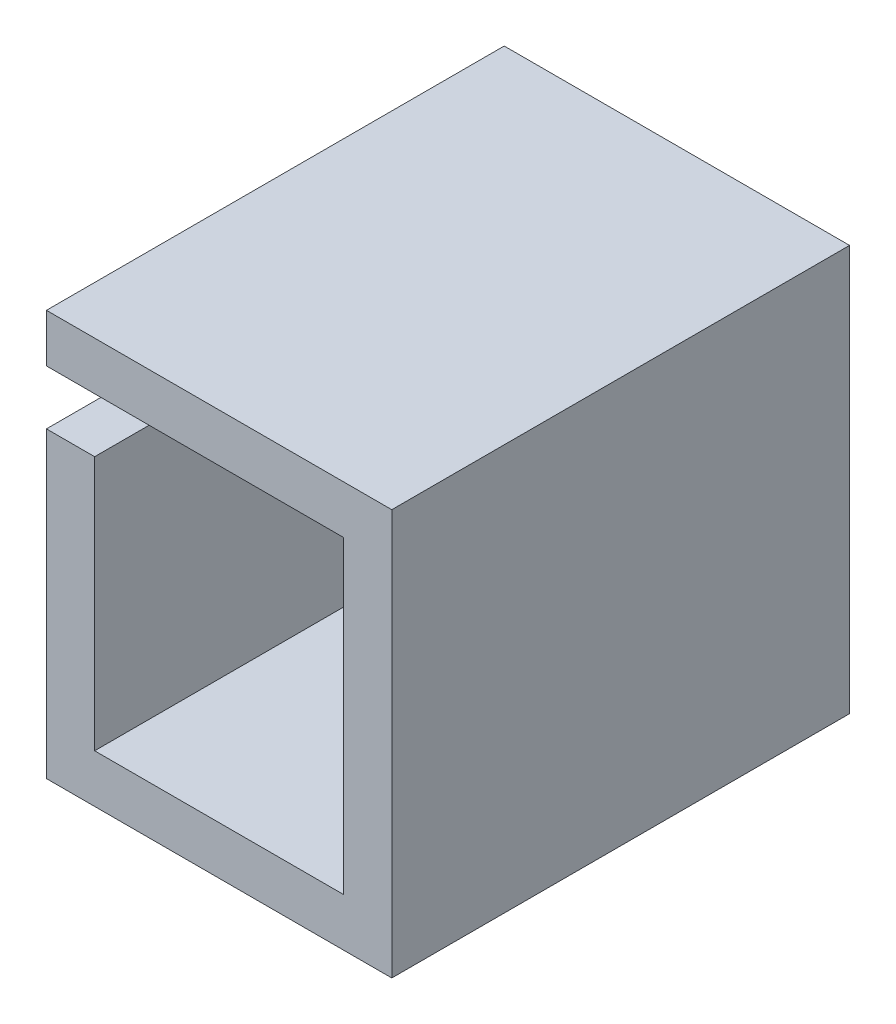
ISO-10303-21;
HEADER;
FILE_DESCRIPTION(('STEP AP214'),'2;1');
FILE_NAME('part.step','',(''),(''),'','','');
FILE_SCHEMA(('AUTOMOTIVE_DESIGN { 1 0 10303 214 1 1 1 1 }'));
ENDSEC;
DATA;
#1=APPLICATION_CONTEXT('core data for automotive mechanical design processes');
#2=APPLICATION_PROTOCOL_DEFINITION('international standard','automotive_design',2000,#1);
#3=PRODUCT_CONTEXT('',#1,'mechanical');
#4=PRODUCT('Part','Part','',(#3));
#5=PRODUCT_RELATED_PRODUCT_CATEGORY('part','',(#4));
#6=PRODUCT_DEFINITION_FORMATION('','',#4);
#7=PRODUCT_DEFINITION_CONTEXT('part definition',#1,'design');
#8=PRODUCT_DEFINITION('design','',#6,#7);
#9=PRODUCT_DEFINITION_SHAPE('','',#8);
#10=(LENGTH_UNIT() NAMED_UNIT(*) SI_UNIT(.MILLI.,.METRE.));
#11=(NAMED_UNIT(*) PLANE_ANGLE_UNIT() SI_UNIT($,.RADIAN.));
#12=(NAMED_UNIT(*) SI_UNIT($,.STERADIAN.) SOLID_ANGLE_UNIT());
#13=UNCERTAINTY_MEASURE_WITH_UNIT(LENGTH_MEASURE(1.E-05),#10,'distance_accuracy_value','');
#14=(GEOMETRIC_REPRESENTATION_CONTEXT(3) GLOBAL_UNCERTAINTY_ASSIGNED_CONTEXT((#13)) GLOBAL_UNIT_ASSIGNED_CONTEXT((#10,
#11,#12)) REPRESENTATION_CONTEXT('',''));
#15=CARTESIAN_POINT('',(0.,0.,0.));
#16=DIRECTION('',(0.,0.,1.));
#17=DIRECTION('',(1.,0.,0.));
#18=AXIS2_PLACEMENT_3D('',#15,#16,#17);
#19=CARTESIAN_POINT('',(3.64285714285715,7.,25.5));
#20=DIRECTION('',(0.,1.,0.));
#21=DIRECTION('',(-1.,0.,0.));
#22=AXIS2_PLACEMENT_3D('',#19,#20,#21);
#23=PLANE('',#22);
#24=DIRECTION('',(1.,0.,0.));
#25=VECTOR('',#24,1.);
#26=CARTESIAN_POINT('',(3.64285714285715,7.,0.));
#27=LINE('',#26,#25);
#28=CARTESIAN_POINT('',(-14.8571428571429,6.99999999999999,0.));
#29=VERTEX_POINT('',#28);
#30=CARTESIAN_POINT('',(3.64285714285715,7.,0.));
#31=VERTEX_POINT('',#30);
#32=EDGE_CURVE('E150',#29,#31,#27,.T.);
#33=ORIENTED_EDGE('',*,*,#32,.T.);
#34=DIRECTION('',(0.,0.,-1.));
#35=VECTOR('',#34,1.);
#36=CARTESIAN_POINT('',(3.64285714285715,7.,25.5));
#37=LINE('',#36,#35);
#38=CARTESIAN_POINT('',(3.64285714285715,7.,25.5));
#39=VERTEX_POINT('',#38);
#40=EDGE_CURVE('E48',#39,#31,#37,.T.);
#41=ORIENTED_EDGE('',*,*,#40,.F.);
#42=DIRECTION('',(1.,0.,0.));
#43=VECTOR('',#42,1.);
#44=CARTESIAN_POINT('',(3.64285714285715,7.,25.5));
#45=LINE('',#44,#43);
#46=CARTESIAN_POINT('',(-14.8571428571429,6.99999999999999,25.5));
#47=VERTEX_POINT('',#46);
#48=EDGE_CURVE('E155',#47,#39,#45,.T.);
#49=ORIENTED_EDGE('',*,*,#48,.F.);
#50=DIRECTION('',(0.,0.,-1.));
#51=VECTOR('',#50,1.);
#52=CARTESIAN_POINT('',(-14.8571428571429,6.99999999999999,25.5));
#53=LINE('',#52,#51);
#54=EDGE_CURVE('E11',#47,#29,#53,.T.);
#55=ORIENTED_EDGE('',*,*,#54,.T.);
#56=EDGE_LOOP('',(#33,#41,#49,#55));
#57=FACE_BOUND('',#56,.T.);
#58=ADVANCED_FACE('F39',(#57),#23,.F.);
#59=CARTESIAN_POINT('',(3.64285714285715,-12.25,25.5));
#60=DIRECTION('',(1.,0.,0.));
#61=DIRECTION('',(0.,0.,-1.));
#62=AXIS2_PLACEMENT_3D('',#59,#60,#61);
#63=PLANE('',#62);
#64=DIRECTION('',(0.,-1.,0.));
#65=VECTOR('',#64,1.);
#66=CARTESIAN_POINT('',(3.64285714285715,-12.25,0.));
#67=LINE('',#66,#65);
#68=CARTESIAN_POINT('',(3.64285714285715,-12.25,0.));
#69=VERTEX_POINT('',#68);
#70=EDGE_CURVE('E185',#31,#69,#67,.T.);
#71=ORIENTED_EDGE('',*,*,#70,.T.);
#72=DIRECTION('',(0.,0.,-1.));
#73=VECTOR('',#72,1.);
#74=CARTESIAN_POINT('',(3.64285714285715,-12.25,25.5));
#75=LINE('',#74,#73);
#76=CARTESIAN_POINT('',(3.64285714285715,-12.25,25.5));
#77=VERTEX_POINT('',#76);
#78=EDGE_CURVE('E218',#77,#69,#75,.T.);
#79=ORIENTED_EDGE('',*,*,#78,.F.);
#80=DIRECTION('',(0.,-1.,0.));
#81=VECTOR('',#80,1.);
#82=CARTESIAN_POINT('',(3.64285714285715,-12.25,25.5));
#83=LINE('',#82,#81);
#84=EDGE_CURVE('E159',#39,#77,#83,.T.);
#85=ORIENTED_EDGE('',*,*,#84,.F.);
#86=ORIENTED_EDGE('',*,*,#40,.T.);
#87=EDGE_LOOP('',(#71,#79,#85,#86));
#88=FACE_BOUND('',#87,.T.);
#89=ADVANCED_FACE('F226',(#88),#63,.F.);
#90=CARTESIAN_POINT('',(-11.8571428571429,-12.25,25.5));
#91=DIRECTION('',(0.,-1.,0.));
#92=DIRECTION('',(0.,0.,-1.));
#93=AXIS2_PLACEMENT_3D('',#90,#91,#92);
#94=PLANE('',#93);
#95=DIRECTION('',(-1.,0.,0.));
#96=VECTOR('',#95,1.);
#97=CARTESIAN_POINT('',(-11.8571428571429,-12.25,0.));
#98=LINE('',#97,#96);
#99=CARTESIAN_POINT('',(-11.8571428571429,-12.25,0.));
#100=VERTEX_POINT('',#99);
#101=EDGE_CURVE('E189',#69,#100,#98,.T.);
#102=ORIENTED_EDGE('',*,*,#101,.T.);
#103=DIRECTION('',(0.,0.,-1.));
#104=VECTOR('',#103,1.);
#105=CARTESIAN_POINT('',(-11.8571428571429,-12.25,25.5));
#106=LINE('',#105,#104);
#107=CARTESIAN_POINT('',(-11.8571428571429,-12.25,25.5));
#108=VERTEX_POINT('',#107);
#109=EDGE_CURVE('E214',#108,#100,#106,.T.);
#110=ORIENTED_EDGE('',*,*,#109,.F.);
#111=DIRECTION('',(-1.,0.,0.));
#112=VECTOR('',#111,1.);
#113=CARTESIAN_POINT('',(-11.8571428571429,-12.25,25.5));
#114=LINE('',#113,#112);
#115=EDGE_CURVE('E162',#77,#108,#114,.T.);
#116=ORIENTED_EDGE('',*,*,#115,.F.);
#117=ORIENTED_EDGE('',*,*,#78,.T.);
#118=EDGE_LOOP('',(#102,#110,#116,#117));
#119=FACE_BOUND('',#118,.T.);
#120=ADVANCED_FACE('F248',(#119),#94,.F.);
#121=CARTESIAN_POINT('',(-11.8571428571429,3.60714285714286,25.5));
#122=DIRECTION('',(-1.,0.,0.));
#123=DIRECTION('',(0.,-1.,0.));
#124=AXIS2_PLACEMENT_3D('',#121,#122,#123);
#125=PLANE('',#124);
#126=DIRECTION('',(0.,1.,0.));
#127=VECTOR('',#126,1.);
#128=CARTESIAN_POINT('',(-11.8571428571429,3.60714285714286,0.));
#129=LINE('',#128,#127);
#130=CARTESIAN_POINT('',(-11.8571428571429,3.60714285714286,0.));
#131=VERTEX_POINT('',#130);
#132=EDGE_CURVE('E193',#100,#131,#129,.T.);
#133=ORIENTED_EDGE('',*,*,#132,.T.);
#134=DIRECTION('',(0.,0.,-1.));
#135=VECTOR('',#134,1.);
#136=CARTESIAN_POINT('',(-11.8571428571429,3.60714285714286,25.5));
#137=LINE('',#136,#135);
#138=CARTESIAN_POINT('',(-11.8571428571429,3.60714285714286,25.5));
#139=VERTEX_POINT('',#138);
#140=EDGE_CURVE('E210',#139,#131,#137,.T.);
#141=ORIENTED_EDGE('',*,*,#140,.F.);
#142=DIRECTION('',(0.,1.,0.));
#143=VECTOR('',#142,1.);
#144=CARTESIAN_POINT('',(-11.8571428571429,3.60714285714286,25.5));
#145=LINE('',#144,#143);
#146=EDGE_CURVE('E165',#108,#139,#145,.T.);
#147=ORIENTED_EDGE('',*,*,#146,.F.);
#148=ORIENTED_EDGE('',*,*,#109,.T.);
#149=EDGE_LOOP('',(#133,#141,#147,#148));
#150=FACE_BOUND('',#149,.T.);
#151=ADVANCED_FACE('F243',(#150),#125,.F.);
#152=CARTESIAN_POINT('',(-14.8571428571429,3.60714285714286,25.5));
#153=DIRECTION('',(0.,-1.,0.));
#154=DIRECTION('',(0.,0.,-1.));
#155=AXIS2_PLACEMENT_3D('',#152,#153,#154);
#156=PLANE('',#155);
#157=DIRECTION('',(-1.,0.,0.));
#158=VECTOR('',#157,1.);
#159=CARTESIAN_POINT('',(-14.8571428571429,3.60714285714286,0.));
#160=LINE('',#159,#158);
#161=CARTESIAN_POINT('',(-14.8571428571429,3.60714285714286,0.));
#162=VERTEX_POINT('',#161);
#163=EDGE_CURVE('E156',#131,#162,#160,.T.);
#164=ORIENTED_EDGE('',*,*,#163,.T.);
#165=DIRECTION('',(0.,0.,-1.));
#166=VECTOR('',#165,1.);
#167=CARTESIAN_POINT('',(-14.8571428571429,3.60714285714286,25.5));
#168=LINE('',#167,#166);
#169=CARTESIAN_POINT('',(-14.8571428571429,3.60714285714286,25.5));
#170=VERTEX_POINT('',#169);
#171=EDGE_CURVE('E206',#170,#162,#168,.T.);
#172=ORIENTED_EDGE('',*,*,#171,.F.);
#173=DIRECTION('',(-1.,0.,0.));
#174=VECTOR('',#173,1.);
#175=CARTESIAN_POINT('',(-14.8571428571429,3.60714285714286,25.5));
#176=LINE('',#175,#174);
#177=EDGE_CURVE('E168',#139,#170,#176,.T.);
#178=ORIENTED_EDGE('',*,*,#177,.F.);
#179=ORIENTED_EDGE('',*,*,#140,.T.);
#180=EDGE_LOOP('',(#164,#172,#178,#179));
#181=FACE_BOUND('',#180,.T.);
#182=ADVANCED_FACE('F240',(#181),#156,.F.);
#183=CARTESIAN_POINT('',(-14.8571428571429,-15.25,25.5));
#184=DIRECTION('',(1.,0.,0.));
#185=DIRECTION('',(0.,1.,0.));
#186=AXIS2_PLACEMENT_3D('',#183,#184,#185);
#187=PLANE('',#186);
#188=ORIENTED_EDGE('',*,*,#171,.T.);
#189=DIRECTION('',(0.,1.,0.));
#190=VECTOR('',#189,1.);
#191=CARTESIAN_POINT('',(-14.8571428571429,9.99999999999999,0.));
#192=LINE('',#191,#190);
#193=EDGE_CURVE('E141',#162,#29,#192,.T.);
#194=ORIENTED_EDGE('',*,*,#193,.T.);
#195=ORIENTED_EDGE('',*,*,#54,.F.);
#196=DIRECTION('',(0.,-1.,0.));
#197=VECTOR('',#196,1.);
#198=CARTESIAN_POINT('',(-14.8571428571429,6.99999999999999,25.5));
#199=LINE('',#198,#197);
#200=CARTESIAN_POINT('',(-14.8571428571429,9.99999999999999,25.5));
#201=VERTEX_POINT('',#200);
#202=EDGE_CURVE('E152',#201,#47,#199,.T.);
#203=ORIENTED_EDGE('',*,*,#202,.F.);
#204=DIRECTION('',(0.,0.,-1.));
#205=VECTOR('',#204,1.);
#206=CARTESIAN_POINT('',(-14.8571428571429,9.99999999999999,25.5));
#207=LINE('',#206,#205);
#208=CARTESIAN_POINT('',(-14.8571428571429,9.99999999999999,-3.));
#209=VERTEX_POINT('',#208);
#210=EDGE_CURVE('E181',#201,#209,#207,.T.);
#211=ORIENTED_EDGE('',*,*,#210,.T.);
#212=DIRECTION('',(0.,1.,0.));
#213=VECTOR('',#212,1.);
#214=CARTESIAN_POINT('',(-14.8571428571429,9.99999999999999,-3.));
#215=LINE('',#214,#213);
#216=CARTESIAN_POINT('',(-14.8571428571429,-15.25,-3.));
#217=VERTEX_POINT('',#216);
#218=EDGE_CURVE('E134',#217,#209,#215,.T.);
#219=ORIENTED_EDGE('',*,*,#218,.F.);
#220=DIRECTION('',(0.,0.,-1.));
#221=VECTOR('',#220,1.);
#222=CARTESIAN_POINT('',(-14.8571428571429,-15.25,25.5));
#223=LINE('',#222,#221);
#224=CARTESIAN_POINT('',(-14.8571428571429,-15.25,25.5));
#225=VERTEX_POINT('',#224);
#226=EDGE_CURVE('E123',#225,#217,#223,.T.);
#227=ORIENTED_EDGE('',*,*,#226,.F.);
#228=DIRECTION('',(0.,-1.,0.));
#229=VECTOR('',#228,1.);
#230=CARTESIAN_POINT('',(-14.8571428571429,-15.25,25.5));
#231=LINE('',#230,#229);
#232=EDGE_CURVE('E171',#170,#225,#231,.T.);
#233=ORIENTED_EDGE('',*,*,#232,.F.);
#234=EDGE_LOOP('',(#188,#194,#195,#203,#211,#219,#227,#233));
#235=FACE_BOUND('',#234,.T.);
#236=ADVANCED_FACE('F234',(#235),#187,.F.);
#237=CARTESIAN_POINT('',(6.64285714285715,-15.25,25.5));
#238=DIRECTION('',(0.,1.,0.));
#239=DIRECTION('',(-1.,0.,0.));
#240=AXIS2_PLACEMENT_3D('',#237,#238,#239);
#241=PLANE('',#240);
#242=ORIENTED_EDGE('',*,*,#226,.T.);
#243=DIRECTION('',(-1.,0.,0.));
#244=VECTOR('',#243,1.);
#245=CARTESIAN_POINT('',(-14.8571428571429,-15.25,-3.));
#246=LINE('',#245,#244);
#247=CARTESIAN_POINT('',(6.64285714285715,-15.25,-3.));
#248=VERTEX_POINT('',#247);
#249=EDGE_CURVE('E127',#248,#217,#246,.T.);
#250=ORIENTED_EDGE('',*,*,#249,.F.);
#251=DIRECTION('',(0.,0.,-1.));
#252=VECTOR('',#251,1.);
#253=CARTESIAN_POINT('',(6.64285714285715,-15.25,25.5));
#254=LINE('',#253,#252);
#255=CARTESIAN_POINT('',(6.64285714285715,-15.25,25.5));
#256=VERTEX_POINT('',#255);
#257=EDGE_CURVE('E113',#256,#248,#254,.T.);
#258=ORIENTED_EDGE('',*,*,#257,.F.);
#259=DIRECTION('',(1.,0.,0.));
#260=VECTOR('',#259,1.);
#261=CARTESIAN_POINT('',(6.64285714285715,-15.25,25.5));
#262=LINE('',#261,#260);
#263=EDGE_CURVE('E174',#225,#256,#262,.T.);
#264=ORIENTED_EDGE('',*,*,#263,.F.);
#265=EDGE_LOOP('',(#242,#250,#258,#264));
#266=FACE_BOUND('',#265,.T.);
#267=ADVANCED_FACE('F128',(#266),#241,.F.);
#268=CARTESIAN_POINT('',(6.64285714285715,9.99999999999999,25.5));
#269=DIRECTION('',(-1.,0.,0.));
#270=DIRECTION('',(0.,-1.,0.));
#271=AXIS2_PLACEMENT_3D('',#268,#269,#270);
#272=PLANE('',#271);
#273=ORIENTED_EDGE('',*,*,#257,.T.);
#274=DIRECTION('',(0.,-1.,0.));
#275=VECTOR('',#274,1.);
#276=CARTESIAN_POINT('',(6.64285714285715,-15.25,-3.));
#277=LINE('',#276,#275);
#278=CARTESIAN_POINT('',(6.64285714285715,9.99999999999999,-3.));
#279=VERTEX_POINT('',#278);
#280=EDGE_CURVE('E118',#279,#248,#277,.T.);
#281=ORIENTED_EDGE('',*,*,#280,.F.);
#282=DIRECTION('',(0.,0.,-1.));
#283=VECTOR('',#282,1.);
#284=CARTESIAN_POINT('',(6.64285714285715,9.99999999999999,25.5));
#285=LINE('',#284,#283);
#286=CARTESIAN_POINT('',(6.64285714285715,9.99999999999999,25.5));
#287=VERTEX_POINT('',#286);
#288=EDGE_CURVE('E124',#287,#279,#285,.T.);
#289=ORIENTED_EDGE('',*,*,#288,.F.);
#290=DIRECTION('',(0.,1.,0.));
#291=VECTOR('',#290,1.);
#292=CARTESIAN_POINT('',(6.64285714285715,9.99999999999999,25.5));
#293=LINE('',#292,#291);
#294=EDGE_CURVE('E119',#256,#287,#293,.T.);
#295=ORIENTED_EDGE('',*,*,#294,.F.);
#296=EDGE_LOOP('',(#273,#281,#289,#295));
#297=FACE_BOUND('',#296,.T.);
#298=ADVANCED_FACE('F115',(#297),#272,.F.);
#299=CARTESIAN_POINT('',(-14.8571428571429,9.99999999999999,25.5));
#300=DIRECTION('',(0.,-1.,0.));
#301=DIRECTION('',(0.,0.,-1.));
#302=AXIS2_PLACEMENT_3D('',#299,#300,#301);
#303=PLANE('',#302);
#304=ORIENTED_EDGE('',*,*,#288,.T.);
#305=DIRECTION('',(1.,0.,0.));
#306=VECTOR('',#305,1.);
#307=CARTESIAN_POINT('',(6.64285714285715,9.99999999999999,-3.));
#308=LINE('',#307,#306);
#309=EDGE_CURVE('E139',#209,#279,#308,.T.);
#310=ORIENTED_EDGE('',*,*,#309,.F.);
#311=ORIENTED_EDGE('',*,*,#210,.F.);
#312=DIRECTION('',(-1.,0.,0.));
#313=VECTOR('',#312,1.);
#314=CARTESIAN_POINT('',(-14.8571428571429,9.99999999999999,25.5));
#315=LINE('',#314,#313);
#316=EDGE_CURVE('E55',#287,#201,#315,.T.);
#317=ORIENTED_EDGE('',*,*,#316,.F.);
#318=EDGE_LOOP('',(#304,#310,#311,#317));
#319=FACE_BOUND('',#318,.T.);
#320=ADVANCED_FACE('F251',(#319),#303,.F.);
#321=CARTESIAN_POINT('',(0.,0.,25.5));
#322=DIRECTION('',(0.,0.,-1.));
#323=DIRECTION('',(-1.,0.,0.));
#324=AXIS2_PLACEMENT_3D('',#321,#322,#323);
#325=PLANE('',#324);
#326=ORIENTED_EDGE('',*,*,#202,.T.);
#327=ORIENTED_EDGE('',*,*,#48,.T.);
#328=ORIENTED_EDGE('',*,*,#84,.T.);
#329=ORIENTED_EDGE('',*,*,#115,.T.);
#330=ORIENTED_EDGE('',*,*,#146,.T.);
#331=ORIENTED_EDGE('',*,*,#177,.T.);
#332=ORIENTED_EDGE('',*,*,#232,.T.);
#333=ORIENTED_EDGE('',*,*,#263,.T.);
#334=ORIENTED_EDGE('',*,*,#294,.T.);
#335=ORIENTED_EDGE('',*,*,#316,.T.);
#336=EDGE_LOOP('',(#326,#327,#328,#329,#330,#331,#332,#333,#334,#335));
#337=FACE_BOUND('',#336,.T.);
#338=ADVANCED_FACE('F249',(#337),#325,.F.);
#339=CARTESIAN_POINT('',(0.,0.,0.));
#340=DIRECTION('',(0.,0.,1.));
#341=DIRECTION('',(1.,0.,0.));
#342=AXIS2_PLACEMENT_3D('',#339,#340,#341);
#343=PLANE('',#342);
#344=ORIENTED_EDGE('',*,*,#163,.F.);
#345=ORIENTED_EDGE('',*,*,#132,.F.);
#346=ORIENTED_EDGE('',*,*,#101,.F.);
#347=ORIENTED_EDGE('',*,*,#70,.F.);
#348=ORIENTED_EDGE('',*,*,#32,.F.);
#349=ORIENTED_EDGE('',*,*,#193,.F.);
#350=EDGE_LOOP('',(#344,#345,#346,#347,#348,#349));
#351=FACE_BOUND('',#350,.T.);
#352=ADVANCED_FACE('F232',(#351),#343,.T.);
#353=CARTESIAN_POINT('',(0.,0.,-3.));
#354=DIRECTION('',(0.,0.,1.));
#355=DIRECTION('',(1.,0.,0.));
#356=AXIS2_PLACEMENT_3D('',#353,#354,#355);
#357=PLANE('',#356);
#358=ORIENTED_EDGE('',*,*,#280,.T.);
#359=ORIENTED_EDGE('',*,*,#249,.T.);
#360=ORIENTED_EDGE('',*,*,#218,.T.);
#361=ORIENTED_EDGE('',*,*,#309,.T.);
#362=EDGE_LOOP('',(#358,#359,#360,#361));
#363=FACE_BOUND('',#362,.T.);
#364=ADVANCED_FACE('F137',(#363),#357,.F.);
#365=CLOSED_SHELL('',(#58,#89,#120,#151,#182,#236,#267,#298,#320,#338,#352,#364));
#366=MANIFOLD_SOLID_BREP('B2',#365);
#367=ADVANCED_BREP_SHAPE_REPRESENTATION('',(#18,#366),#14);
#368=SHAPE_DEFINITION_REPRESENTATION(#9,#367);
ENDSEC;
END-ISO-10303-21;
